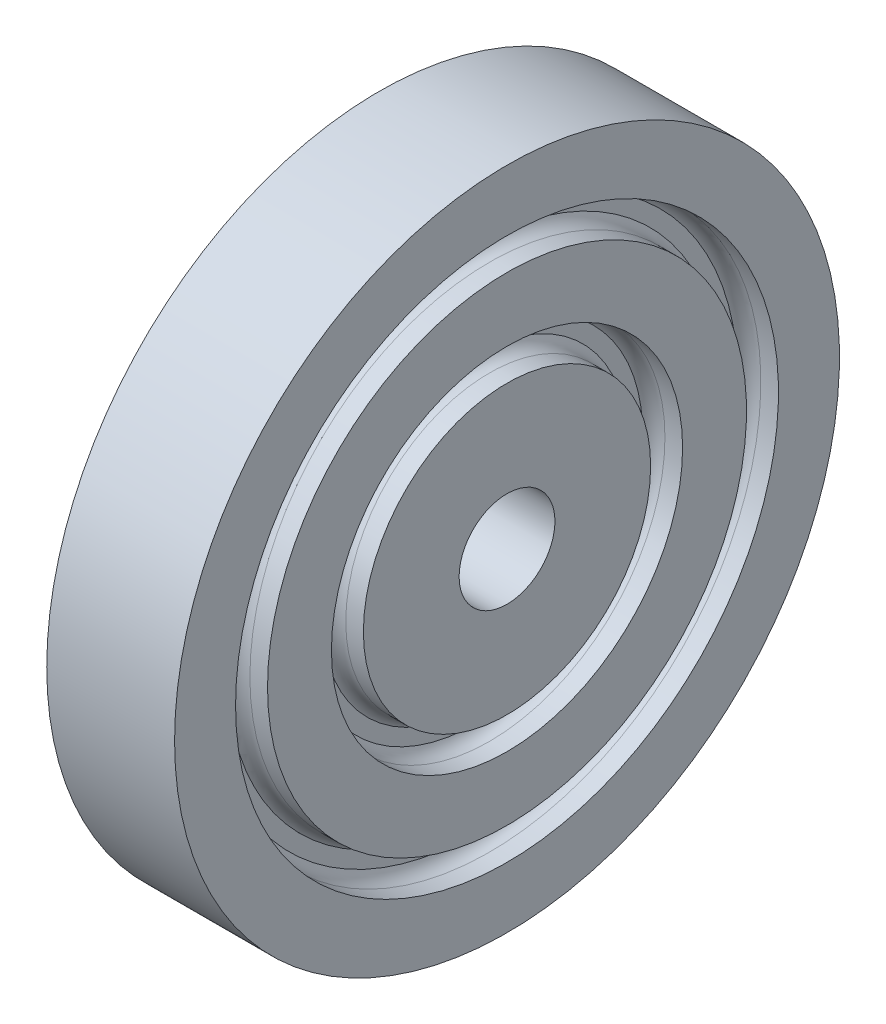
ISO-10303-21;
HEADER;
FILE_DESCRIPTION(('STEP AP214'),'2;1');
FILE_NAME('part.step','',(''),(''),'','','');
FILE_SCHEMA(('AUTOMOTIVE_DESIGN { 1 0 10303 214 1 1 1 1 }'));
ENDSEC;
DATA;
#1=APPLICATION_CONTEXT('core data for automotive mechanical design processes');
#2=APPLICATION_PROTOCOL_DEFINITION('international standard','automotive_design',2000,#1);
#3=PRODUCT_CONTEXT('',#1,'mechanical');
#4=PRODUCT('Part','Part','',(#3));
#5=PRODUCT_RELATED_PRODUCT_CATEGORY('part','',(#4));
#6=PRODUCT_DEFINITION_FORMATION('','',#4);
#7=PRODUCT_DEFINITION_CONTEXT('part definition',#1,'design');
#8=PRODUCT_DEFINITION('design','',#6,#7);
#9=PRODUCT_DEFINITION_SHAPE('','',#8);
#10=(LENGTH_UNIT() NAMED_UNIT(*) SI_UNIT(.MILLI.,.METRE.));
#11=(NAMED_UNIT(*) PLANE_ANGLE_UNIT() SI_UNIT($,.RADIAN.));
#12=(NAMED_UNIT(*) SI_UNIT($,.STERADIAN.) SOLID_ANGLE_UNIT());
#13=UNCERTAINTY_MEASURE_WITH_UNIT(LENGTH_MEASURE(1.E-05),#10,'distance_accuracy_value','');
#14=(GEOMETRIC_REPRESENTATION_CONTEXT(3) GLOBAL_UNCERTAINTY_ASSIGNED_CONTEXT((#13)) GLOBAL_UNIT_ASSIGNED_CONTEXT((#10,
#11,#12)) REPRESENTATION_CONTEXT('',''));
#15=CARTESIAN_POINT('',(0.,0.,0.));
#16=DIRECTION('',(0.,0.,1.));
#17=DIRECTION('',(1.,0.,0.));
#18=AXIS2_PLACEMENT_3D('',#15,#16,#17);
#19=CARTESIAN_POINT('',(-1.07134394896736,-1.61557345247424,0.));
#20=DIRECTION('',(-1.,0.,0.));
#21=DIRECTION('',(0.,0.,1.));
#22=AXIS2_PLACEMENT_3D('',#19,#20,#21);
#23=CYLINDRICAL_SURFACE('',#22,1.34761288189039);
#24=CARTESIAN_POINT('',(0.,-1.61557345247424,0.));
#25=DIRECTION('',(-1.,0.,0.));
#26=DIRECTION('',(0.,0.,1.));
#27=AXIS2_PLACEMENT_3D('',#24,#25,#26);
#28=CIRCLE('',#27,1.34761288189039);
#29=CARTESIAN_POINT('',(0.,-1.61557345247424,1.34761288189039));
#30=VERTEX_POINT('',#29);
#31=EDGE_CURVE('E121',#30,#30,#28,.T.);
#32=ORIENTED_EDGE('',*,*,#31,.T.);
#33=EDGE_LOOP('',(#32));
#34=FACE_BOUND('',#33,.T.);
#35=CARTESIAN_POINT('',(0.146155721721138,-1.61557345247424,0.));
#36=DIRECTION('',(-1.,0.,0.));
#37=DIRECTION('',(0.,0.,1.));
#38=AXIS2_PLACEMENT_3D('',#35,#36,#37);
#39=CIRCLE('',#38,1.34761288189039);
#40=CARTESIAN_POINT('',(0.146155721721138,-1.61557345247424,1.34761288189039));
#41=VERTEX_POINT('',#40);
#42=EDGE_CURVE('E10',#41,#41,#39,.T.);
#43=ORIENTED_EDGE('',*,*,#42,.F.);
#44=EDGE_LOOP('',(#43));
#45=FACE_BOUND('',#44,.T.);
#46=ADVANCED_FACE('F33',(#34,#45),#23,.F.);
#47=CARTESIAN_POINT('',(0.137801848656548,-1.61557345247424,0.));
#48=DIRECTION('',(-1.,0.,0.));
#49=DIRECTION('',(0.,0.,1.));
#50=AXIS2_PLACEMENT_3D('',#47,#48,#49);
#51=TOROIDAL_SURFACE('',#50,1.21608798375135,0.131789931427495);
#52=CARTESIAN_POINT('',(0.252119261734422,-1.61557345247424,0.));
#53=DIRECTION('',(-1.,0.,0.));
#54=DIRECTION('',(0.,0.,1.));
#55=AXIS2_PLACEMENT_3D('',#52,#53,#54);
#56=CIRCLE('',#55,1.28166324656323);
#57=CARTESIAN_POINT('',(0.252119261734422,-1.61557345247424,1.28166324656323));
#58=VERTEX_POINT('',#57);
#59=EDGE_CURVE('E39',#58,#58,#56,.T.);
#60=ORIENTED_EDGE('',*,*,#59,.F.);
#61=EDGE_LOOP('',(#60));
#62=FACE_BOUND('',#61,.T.);
#63=ORIENTED_EDGE('',*,*,#42,.T.);
#64=EDGE_LOOP('',(#63));
#65=FACE_BOUND('',#64,.T.);
#66=ADVANCED_FACE('F151',(#62,#65),#51,.F.);
#67=CARTESIAN_POINT('',(0.252119261734422,0.,0.));
#68=DIRECTION('',(-1.,0.,0.));
#69=DIRECTION('',(0.,0.,1.));
#70=AXIS2_PLACEMENT_3D('',#67,#68,#69);
#71=PLANE('',#70);
#72=ORIENTED_EDGE('',*,*,#59,.T.);
#73=EDGE_LOOP('',(#72));
#74=FACE_BOUND('',#73,.T.);
#75=CARTESIAN_POINT('',(0.252119261734422,-1.61557345247424,0.));
#76=DIRECTION('',(-1.,0.,0.));
#77=DIRECTION('',(0.,0.,1.));
#78=AXIS2_PLACEMENT_3D('',#75,#76,#77);
#79=CIRCLE('',#78,1.17169865184732);
#80=CARTESIAN_POINT('',(0.252119261734422,-1.61557345247424,1.17169865184732));
#81=VERTEX_POINT('',#80);
#82=EDGE_CURVE('E43',#81,#81,#79,.T.);
#83=ORIENTED_EDGE('',*,*,#82,.F.);
#84=EDGE_LOOP('',(#83));
#85=FACE_BOUND('',#84,.T.);
#86=ADVANCED_FACE('F155',(#74,#85),#71,.T.);
#87=CARTESIAN_POINT('',(0.137890983876598,-1.61557345247424,0.));
#88=DIRECTION('',(-1.,0.,0.));
#89=DIRECTION('',(0.,0.,1.));
#90=AXIS2_PLACEMENT_3D('',#87,#88,#89);
#91=TOROIDAL_SURFACE('',#90,1.22246183277243,0.125);
#92=ORIENTED_EDGE('',*,*,#82,.T.);
#93=EDGE_LOOP('',(#92));
#94=FACE_BOUND('',#93,.T.);
#95=CARTESIAN_POINT('',(0.146155721721138,-1.61557345247424,0.));
#96=DIRECTION('',(-1.,0.,0.));
#97=DIRECTION('',(0.,0.,1.));
#98=AXIS2_PLACEMENT_3D('',#95,#96,#97);
#99=CIRCLE('',#98,1.09773535559793);
#100=CARTESIAN_POINT('',(0.146155721721138,-1.61557345247424,1.09773535559793));
#101=VERTEX_POINT('',#100);
#102=EDGE_CURVE('E47',#101,#101,#99,.T.);
#103=ORIENTED_EDGE('',*,*,#102,.F.);
#104=EDGE_LOOP('',(#103));
#105=FACE_BOUND('',#104,.T.);
#106=ADVANCED_FACE('F160',(#94,#105),#91,.F.);
#107=CARTESIAN_POINT('',(0.,-1.61557345247424,0.));
#108=DIRECTION('',(1.,0.,0.));
#109=DIRECTION('',(0.,0.,-1.));
#110=AXIS2_PLACEMENT_3D('',#107,#108,#109);
#111=CONICAL_SURFACE('',#110,1.09761288189039,0.000837967049351085);
#112=ORIENTED_EDGE('',*,*,#102,.T.);
#113=EDGE_LOOP('',(#112));
#114=FACE_BOUND('',#113,.T.);
#115=CARTESIAN_POINT('',(0.,-1.61557345247424,0.));
#116=DIRECTION('',(-1.,0.,0.));
#117=DIRECTION('',(0.,0.,1.));
#118=AXIS2_PLACEMENT_3D('',#115,#116,#117);
#119=CIRCLE('',#118,1.09761288189039);
#120=CARTESIAN_POINT('',(0.,-1.61557345247424,1.09761288189039));
#121=VERTEX_POINT('',#120);
#122=EDGE_CURVE('E52',#121,#121,#119,.T.);
#123=ORIENTED_EDGE('',*,*,#122,.F.);
#124=EDGE_LOOP('',(#123));
#125=FACE_BOUND('',#124,.T.);
#126=ADVANCED_FACE('F165',(#114,#125),#111,.T.);
#127=CARTESIAN_POINT('',(0.,0.,0.));
#128=DIRECTION('',(1.,0.,0.));
#129=DIRECTION('',(0.,0.,-1.));
#130=AXIS2_PLACEMENT_3D('',#127,#128,#129);
#131=PLANE('',#130);
#132=CARTESIAN_POINT('',(0.,-1.61557345247424,0.));
#133=DIRECTION('',(-1.,0.,0.));
#134=DIRECTION('',(0.,0.,1.));
#135=AXIS2_PLACEMENT_3D('',#132,#133,#134);
#136=CIRCLE('',#135,0.374707986907648);
#137=CARTESIAN_POINT('',(0.,-1.61557345247424,0.374707986907648));
#138=VERTEX_POINT('',#137);
#139=EDGE_CURVE('E55',#138,#138,#136,.T.);
#140=ORIENTED_EDGE('',*,*,#139,.F.);
#141=EDGE_LOOP('',(#140));
#142=FACE_BOUND('',#141,.T.);
#143=ORIENTED_EDGE('',*,*,#122,.T.);
#144=EDGE_LOOP('',(#143));
#145=FACE_BOUND('',#144,.T.);
#146=ADVANCED_FACE('F169',(#142,#145),#131,.F.);
#147=CARTESIAN_POINT('',(-1.07134394896736,-1.61557345247424,0.));
#148=DIRECTION('',(-1.,0.,0.));
#149=DIRECTION('',(0.,0.,1.));
#150=AXIS2_PLACEMENT_3D('',#147,#148,#149);
#151=CYLINDRICAL_SURFACE('',#150,0.374707986907648);
#152=ORIENTED_EDGE('',*,*,#139,.T.);
#153=EDGE_LOOP('',(#152));
#154=FACE_BOUND('',#153,.T.);
#155=CARTESIAN_POINT('',(1.,-1.61557345247424,0.));
#156=DIRECTION('',(-1.,0.,0.));
#157=DIRECTION('',(0.,0.,1.));
#158=AXIS2_PLACEMENT_3D('',#155,#156,#157);
#159=CIRCLE('',#158,0.374707986907648);
#160=CARTESIAN_POINT('',(1.,-1.61557345247424,0.374707986907648));
#161=VERTEX_POINT('',#160);
#162=EDGE_CURVE('E58',#161,#161,#159,.T.);
#163=ORIENTED_EDGE('',*,*,#162,.F.);
#164=EDGE_LOOP('',(#163));
#165=FACE_BOUND('',#164,.T.);
#166=ADVANCED_FACE('F173',(#154,#165),#151,.F.);
#167=CARTESIAN_POINT('',(1.,0.,0.));
#168=DIRECTION('',(1.,0.,0.));
#169=DIRECTION('',(0.,0.,-1.));
#170=AXIS2_PLACEMENT_3D('',#167,#168,#169);
#171=PLANE('',#170);
#172=ORIENTED_EDGE('',*,*,#162,.T.);
#173=EDGE_LOOP('',(#172));
#174=FACE_BOUND('',#173,.T.);
#175=CARTESIAN_POINT('',(1.,-1.61557345247424,0.));
#176=DIRECTION('',(-1.,0.,0.));
#177=DIRECTION('',(0.,0.,1.));
#178=AXIS2_PLACEMENT_3D('',#175,#176,#177);
#179=CIRCLE('',#178,1.12347935603458);
#180=CARTESIAN_POINT('',(1.,-1.61557345247424,1.12347935603458));
#181=VERTEX_POINT('',#180);
#182=EDGE_CURVE('E61',#181,#181,#179,.T.);
#183=ORIENTED_EDGE('',*,*,#182,.F.);
#184=EDGE_LOOP('',(#183));
#185=FACE_BOUND('',#184,.T.);
#186=ADVANCED_FACE('F177',(#174,#185),#171,.T.);
#187=CARTESIAN_POINT('',(-1.07134394896736,-1.61557345247424,0.));
#188=DIRECTION('',(-1.,0.,0.));
#189=DIRECTION('',(0.,0.,1.));
#190=AXIS2_PLACEMENT_3D('',#187,#188,#189);
#191=CYLINDRICAL_SURFACE('',#190,1.12347935603458);
#192=CARTESIAN_POINT('',(0.862034400093369,-1.61557345247424,0.));
#193=DIRECTION('',(-1.,0.,0.));
#194=DIRECTION('',(0.,0.,1.));
#195=AXIS2_PLACEMENT_3D('',#192,#193,#194);
#196=CIRCLE('',#195,1.12347935603458);
#197=CARTESIAN_POINT('',(0.862034400093369,-1.61557345247424,1.12347935603458));
#198=VERTEX_POINT('',#197);
#199=EDGE_CURVE('E64',#198,#198,#196,.T.);
#200=ORIENTED_EDGE('',*,*,#199,.F.);
#201=EDGE_LOOP('',(#200));
#202=FACE_BOUND('',#201,.T.);
#203=ORIENTED_EDGE('',*,*,#182,.T.);
#204=EDGE_LOOP('',(#203));
#205=FACE_BOUND('',#204,.T.);
#206=ADVANCED_FACE('F179',(#202,#205),#191,.T.);
#207=CARTESIAN_POINT('',(0.862034400093369,-1.61557345247424,0.));
#208=DIRECTION('',(-1.,0.,0.));
#209=DIRECTION('',(0.,0.,1.));
#210=AXIS2_PLACEMENT_3D('',#207,#208,#209);
#211=TOROIDAL_SURFACE('',#210,1.24847935603458,0.125);
#212=CARTESIAN_POINT('',(0.75,-1.61557345247424,0.));
#213=DIRECTION('',(-1.,0.,0.));
#214=DIRECTION('',(0.,0.,1.));
#215=AXIS2_PLACEMENT_3D('',#212,#213,#214);
#216=CIRCLE('',#215,1.1930420653746);
#217=CARTESIAN_POINT('',(0.75,-1.61557345247424,1.1930420653746));
#218=VERTEX_POINT('',#217);
#219=EDGE_CURVE('E67',#218,#218,#216,.T.);
#220=ORIENTED_EDGE('',*,*,#219,.F.);
#221=EDGE_LOOP('',(#220));
#222=FACE_BOUND('',#221,.T.);
#223=ORIENTED_EDGE('',*,*,#199,.T.);
#224=EDGE_LOOP('',(#223));
#225=FACE_BOUND('',#224,.T.);
#226=ADVANCED_FACE('F182',(#222,#225),#211,.F.);
#227=CARTESIAN_POINT('',(0.75,0.,0.));
#228=DIRECTION('',(-1.,0.,0.));
#229=DIRECTION('',(0.,0.,1.));
#230=AXIS2_PLACEMENT_3D('',#227,#228,#229);
#231=PLANE('',#230);
#232=CARTESIAN_POINT('',(0.75,-1.61557345247424,0.));
#233=DIRECTION('',(-1.,0.,0.));
#234=DIRECTION('',(0.,0.,1.));
#235=AXIS2_PLACEMENT_3D('',#232,#233,#234);
#236=CIRCLE('',#235,1.31109316529433);
#237=CARTESIAN_POINT('',(0.75,-1.61557345247424,1.31109316529433));
#238=VERTEX_POINT('',#237);
#239=EDGE_CURVE('E70',#238,#238,#236,.T.);
#240=ORIENTED_EDGE('',*,*,#239,.F.);
#241=EDGE_LOOP('',(#240));
#242=FACE_BOUND('',#241,.T.);
#243=ORIENTED_EDGE('',*,*,#219,.T.);
#244=EDGE_LOOP('',(#243));
#245=FACE_BOUND('',#244,.T.);
#246=ADVANCED_FACE('F186',(#242,#245),#231,.F.);
#247=CARTESIAN_POINT('',(0.862034400093369,-1.61557345247424,0.));
#248=DIRECTION('',(-1.,0.,0.));
#249=DIRECTION('',(0.,0.,1.));
#250=AXIS2_PLACEMENT_3D('',#247,#248,#249);
#251=TOROIDAL_SURFACE('',#250,1.24168942460708,0.131789931427495);
#252=ORIENTED_EDGE('',*,*,#239,.T.);
#253=EDGE_LOOP('',(#252));
#254=FACE_BOUND('',#253,.T.);
#255=CARTESIAN_POINT('',(0.86203440009337,-1.61557345247424,0.));
#256=DIRECTION('',(-1.,0.,0.));
#257=DIRECTION('',(0.,0.,1.));
#258=AXIS2_PLACEMENT_3D('',#255,#256,#257);
#259=CIRCLE('',#258,1.37347935603458);
#260=CARTESIAN_POINT('',(0.86203440009337,-1.61557345247424,1.37347935603458));
#261=VERTEX_POINT('',#260);
#262=EDGE_CURVE('E73',#261,#261,#259,.T.);
#263=ORIENTED_EDGE('',*,*,#262,.F.);
#264=EDGE_LOOP('',(#263));
#265=FACE_BOUND('',#264,.T.);
#266=ADVANCED_FACE('F190',(#254,#265),#251,.F.);
#267=CARTESIAN_POINT('',(-1.07134394896736,-1.61557345247424,0.));
#268=DIRECTION('',(-1.,0.,0.));
#269=DIRECTION('',(0.,0.,1.));
#270=AXIS2_PLACEMENT_3D('',#267,#268,#269);
#271=CYLINDRICAL_SURFACE('',#270,1.37347935603458);
#272=CARTESIAN_POINT('',(1.,-1.61557345247424,0.));
#273=DIRECTION('',(-1.,0.,0.));
#274=DIRECTION('',(0.,0.,1.));
#275=AXIS2_PLACEMENT_3D('',#272,#273,#274);
#276=CIRCLE('',#275,1.37347935603458);
#277=CARTESIAN_POINT('',(1.,-1.61557345247424,1.37347935603458));
#278=VERTEX_POINT('',#277);
#279=EDGE_CURVE('E76',#278,#278,#276,.T.);
#280=ORIENTED_EDGE('',*,*,#279,.F.);
#281=EDGE_LOOP('',(#280));
#282=FACE_BOUND('',#281,.T.);
#283=ORIENTED_EDGE('',*,*,#262,.T.);
#284=EDGE_LOOP('',(#283));
#285=FACE_BOUND('',#284,.T.);
#286=ADVANCED_FACE('F194',(#282,#285),#271,.F.);
#287=ORIENTED_EDGE('',*,*,#279,.T.);
#288=EDGE_LOOP('',(#287));
#289=FACE_BOUND('',#288,.T.);
#290=CARTESIAN_POINT('',(1.,-1.61557345247424,0.));
#291=DIRECTION('',(-1.,0.,0.));
#292=DIRECTION('',(0.,0.,1.));
#293=AXIS2_PLACEMENT_3D('',#290,#291,#292);
#294=CIRCLE('',#293,1.87347935603458);
#295=CARTESIAN_POINT('',(1.,-1.61557345247424,1.87347935603458));
#296=VERTEX_POINT('',#295);
#297=EDGE_CURVE('E79',#296,#296,#294,.T.);
#298=ORIENTED_EDGE('',*,*,#297,.F.);
#299=EDGE_LOOP('',(#298));
#300=FACE_BOUND('',#299,.T.);
#301=ADVANCED_FACE('F198',(#289,#300),#171,.T.);
#302=CARTESIAN_POINT('',(-1.07134394896736,-1.61557345247424,0.));
#303=DIRECTION('',(-1.,0.,0.));
#304=DIRECTION('',(0.,0.,1.));
#305=AXIS2_PLACEMENT_3D('',#302,#303,#304);
#306=CYLINDRICAL_SURFACE('',#305,1.87347935603458);
#307=ORIENTED_EDGE('',*,*,#297,.T.);
#308=EDGE_LOOP('',(#307));
#309=FACE_BOUND('',#308,.T.);
#310=CARTESIAN_POINT('',(0.86203440009337,-1.61557345247424,0.));
#311=DIRECTION('',(-1.,0.,0.));
#312=DIRECTION('',(0.,0.,1.));
#313=AXIS2_PLACEMENT_3D('',#310,#311,#312);
#314=CIRCLE('',#313,1.87347935603458);
#315=CARTESIAN_POINT('',(0.86203440009337,-1.61557345247424,1.87347935603458));
#316=VERTEX_POINT('',#315);
#317=EDGE_CURVE('E82',#316,#316,#314,.T.);
#318=ORIENTED_EDGE('',*,*,#317,.F.);
#319=EDGE_LOOP('',(#318));
#320=FACE_BOUND('',#319,.T.);
#321=ADVANCED_FACE('F202',(#309,#320),#306,.T.);
#322=CARTESIAN_POINT('',(0.862034400093369,-1.61557345247424,0.));
#323=DIRECTION('',(-1.,0.,0.));
#324=DIRECTION('',(0.,0.,1.));
#325=AXIS2_PLACEMENT_3D('',#322,#323,#324);
#326=TOROIDAL_SURFACE('',#325,2.00526928746208,0.131789931427495);
#327=CARTESIAN_POINT('',(0.75,-1.61557345247424,0.));
#328=DIRECTION('',(-1.,0.,0.));
#329=DIRECTION('',(0.,0.,1.));
#330=AXIS2_PLACEMENT_3D('',#327,#328,#329);
#331=CIRCLE('',#330,1.93586554677483);
#332=CARTESIAN_POINT('',(0.75,-1.61557345247424,1.93586554677483));
#333=VERTEX_POINT('',#332);
#334=EDGE_CURVE('E85',#333,#333,#331,.T.);
#335=ORIENTED_EDGE('',*,*,#334,.F.);
#336=EDGE_LOOP('',(#335));
#337=FACE_BOUND('',#336,.T.);
#338=ORIENTED_EDGE('',*,*,#317,.T.);
#339=EDGE_LOOP('',(#338));
#340=FACE_BOUND('',#339,.T.);
#341=ADVANCED_FACE('F206',(#337,#340),#326,.F.);
#342=CARTESIAN_POINT('',(0.75,0.,0.));
#343=DIRECTION('',(1.,0.,0.));
#344=DIRECTION('',(0.,0.,-1.));
#345=AXIS2_PLACEMENT_3D('',#342,#343,#344);
#346=PLANE('',#345);
#347=ORIENTED_EDGE('',*,*,#334,.T.);
#348=EDGE_LOOP('',(#347));
#349=FACE_BOUND('',#348,.T.);
#350=CARTESIAN_POINT('',(0.75,-1.61557345247424,0.));
#351=DIRECTION('',(-1.,0.,0.));
#352=DIRECTION('',(0.,0.,1.));
#353=AXIS2_PLACEMENT_3D('',#350,#351,#352);
#354=CIRCLE('',#353,2.05391664669456);
#355=CARTESIAN_POINT('',(0.75,-1.61557345247424,2.05391664669456));
#356=VERTEX_POINT('',#355);
#357=EDGE_CURVE('E88',#356,#356,#354,.T.);
#358=ORIENTED_EDGE('',*,*,#357,.F.);
#359=EDGE_LOOP('',(#358));
#360=FACE_BOUND('',#359,.T.);
#361=ADVANCED_FACE('F210',(#349,#360),#346,.T.);
#362=CARTESIAN_POINT('',(0.862034400093369,-1.61557345247424,0.));
#363=DIRECTION('',(-1.,0.,0.));
#364=DIRECTION('',(0.,0.,1.));
#365=AXIS2_PLACEMENT_3D('',#362,#363,#364);
#366=TOROIDAL_SURFACE('',#365,1.99847935603458,0.125);
#367=ORIENTED_EDGE('',*,*,#357,.T.);
#368=EDGE_LOOP('',(#367));
#369=FACE_BOUND('',#368,.T.);
#370=CARTESIAN_POINT('',(0.862034400093369,-1.61557345247424,0.));
#371=DIRECTION('',(-1.,0.,0.));
#372=DIRECTION('',(0.,0.,1.));
#373=AXIS2_PLACEMENT_3D('',#370,#371,#372);
#374=CIRCLE('',#373,2.12347935603458);
#375=CARTESIAN_POINT('',(0.862034400093369,-1.61557345247424,2.12347935603458));
#376=VERTEX_POINT('',#375);
#377=EDGE_CURVE('E91',#376,#376,#374,.T.);
#378=ORIENTED_EDGE('',*,*,#377,.F.);
#379=EDGE_LOOP('',(#378));
#380=FACE_BOUND('',#379,.T.);
#381=ADVANCED_FACE('F214',(#369,#380),#366,.F.);
#382=CARTESIAN_POINT('',(-1.07134394896736,-1.61557345247424,0.));
#383=DIRECTION('',(-1.,0.,0.));
#384=DIRECTION('',(0.,0.,1.));
#385=AXIS2_PLACEMENT_3D('',#382,#383,#384);
#386=CYLINDRICAL_SURFACE('',#385,2.12347935603458);
#387=ORIENTED_EDGE('',*,*,#377,.T.);
#388=EDGE_LOOP('',(#387));
#389=FACE_BOUND('',#388,.T.);
#390=CARTESIAN_POINT('',(1.,-1.61557345247424,0.));
#391=DIRECTION('',(-1.,0.,0.));
#392=DIRECTION('',(0.,0.,1.));
#393=AXIS2_PLACEMENT_3D('',#390,#391,#392);
#394=CIRCLE('',#393,2.12347935603458);
#395=CARTESIAN_POINT('',(1.,-1.61557345247424,2.12347935603458));
#396=VERTEX_POINT('',#395);
#397=EDGE_CURVE('E94',#396,#396,#394,.T.);
#398=ORIENTED_EDGE('',*,*,#397,.F.);
#399=EDGE_LOOP('',(#398));
#400=FACE_BOUND('',#399,.T.);
#401=ADVANCED_FACE('F218',(#389,#400),#386,.F.);
#402=CARTESIAN_POINT('',(1.,0.,0.));
#403=DIRECTION('',(1.,0.,0.));
#404=DIRECTION('',(0.,0.,-1.));
#405=AXIS2_PLACEMENT_3D('',#402,#403,#404);
#406=PLANE('',#405);
#407=ORIENTED_EDGE('',*,*,#397,.T.);
#408=EDGE_LOOP('',(#407));
#409=FACE_BOUND('',#408,.T.);
#410=CARTESIAN_POINT('',(1.,-1.61557345247424,0.));
#411=DIRECTION('',(-1.,0.,0.));
#412=DIRECTION('',(0.,0.,1.));
#413=AXIS2_PLACEMENT_3D('',#410,#411,#412);
#414=CIRCLE('',#413,2.60051777687314);
#415=CARTESIAN_POINT('',(1.,-1.61557345247424,2.60051777687314));
#416=VERTEX_POINT('',#415);
#417=EDGE_CURVE('E97',#416,#416,#414,.T.);
#418=ORIENTED_EDGE('',*,*,#417,.F.);
#419=EDGE_LOOP('',(#418));
#420=FACE_BOUND('',#419,.T.);
#421=ADVANCED_FACE('F222',(#409,#420),#406,.T.);
#422=CARTESIAN_POINT('',(-1.07134394896736,-1.61557345247424,0.));
#423=DIRECTION('',(-1.,0.,0.));
#424=DIRECTION('',(0.,0.,1.));
#425=AXIS2_PLACEMENT_3D('',#422,#423,#424);
#426=CYLINDRICAL_SURFACE('',#425,2.60051777687314);
#427=ORIENTED_EDGE('',*,*,#417,.T.);
#428=EDGE_LOOP('',(#427));
#429=FACE_BOUND('',#428,.T.);
#430=CARTESIAN_POINT('',(0.,-1.61557345247424,0.));
#431=DIRECTION('',(-1.,0.,0.));
#432=DIRECTION('',(0.,0.,1.));
#433=AXIS2_PLACEMENT_3D('',#430,#431,#432);
#434=CIRCLE('',#433,2.60051777687314);
#435=CARTESIAN_POINT('',(0.,-1.61557345247424,2.60051777687314));
#436=VERTEX_POINT('',#435);
#437=EDGE_CURVE('E100',#436,#436,#434,.T.);
#438=ORIENTED_EDGE('',*,*,#437,.F.);
#439=EDGE_LOOP('',(#438));
#440=FACE_BOUND('',#439,.T.);
#441=ADVANCED_FACE('F226',(#429,#440),#426,.T.);
#442=CARTESIAN_POINT('',(0.,0.,0.));
#443=DIRECTION('',(1.,0.,0.));
#444=DIRECTION('',(0.,0.,-1.));
#445=AXIS2_PLACEMENT_3D('',#442,#443,#444);
#446=PLANE('',#445);
#447=CARTESIAN_POINT('',(0.,-1.61557345247424,0.));
#448=DIRECTION('',(-1.,0.,0.));
#449=DIRECTION('',(0.,0.,1.));
#450=AXIS2_PLACEMENT_3D('',#447,#448,#449);
#451=CIRCLE('',#450,2.12347935603458);
#452=CARTESIAN_POINT('',(0.,-1.61557345247424,2.12347935603458));
#453=VERTEX_POINT('',#452);
#454=EDGE_CURVE('E103',#453,#453,#451,.T.);
#455=ORIENTED_EDGE('',*,*,#454,.F.);
#456=EDGE_LOOP('',(#455));
#457=FACE_BOUND('',#456,.T.);
#458=ORIENTED_EDGE('',*,*,#437,.T.);
#459=EDGE_LOOP('',(#458));
#460=FACE_BOUND('',#459,.T.);
#461=ADVANCED_FACE('F230',(#457,#460),#446,.F.);
#462=CARTESIAN_POINT('',(-1.07134394896736,-1.61557345247424,0.));
#463=DIRECTION('',(-1.,0.,0.));
#464=DIRECTION('',(0.,0.,1.));
#465=AXIS2_PLACEMENT_3D('',#462,#463,#464);
#466=CYLINDRICAL_SURFACE('',#465,2.12347935603458);
#467=CARTESIAN_POINT('',(0.137965599906632,-1.61557345247424,0.));
#468=DIRECTION('',(-1.,0.,0.));
#469=DIRECTION('',(0.,0.,1.));
#470=AXIS2_PLACEMENT_3D('',#467,#468,#469);
#471=CIRCLE('',#470,2.12347935603458);
#472=CARTESIAN_POINT('',(0.137965599906632,-1.61557345247424,2.12347935603458));
#473=VERTEX_POINT('',#472);
#474=EDGE_CURVE('E106',#473,#473,#471,.T.);
#475=ORIENTED_EDGE('',*,*,#474,.F.);
#476=EDGE_LOOP('',(#475));
#477=FACE_BOUND('',#476,.T.);
#478=ORIENTED_EDGE('',*,*,#454,.T.);
#479=EDGE_LOOP('',(#478));
#480=FACE_BOUND('',#479,.T.);
#481=ADVANCED_FACE('F234',(#477,#480),#466,.F.);
#482=CARTESIAN_POINT('',(0.137965599906632,-1.61557345247424,0.));
#483=DIRECTION('',(-1.,0.,0.));
#484=DIRECTION('',(0.,0.,1.));
#485=AXIS2_PLACEMENT_3D('',#482,#483,#484);
#486=TOROIDAL_SURFACE('',#485,1.99847935603458,0.125);
#487=CARTESIAN_POINT('',(0.25,-1.61557345247424,0.));
#488=DIRECTION('',(-1.,0.,0.));
#489=DIRECTION('',(0.,0.,1.));
#490=AXIS2_PLACEMENT_3D('',#487,#488,#489);
#491=CIRCLE('',#490,2.05391664669456);
#492=CARTESIAN_POINT('',(0.25,-1.61557345247424,2.05391664669456));
#493=VERTEX_POINT('',#492);
#494=EDGE_CURVE('E109',#493,#493,#491,.T.);
#495=ORIENTED_EDGE('',*,*,#494,.F.);
#496=EDGE_LOOP('',(#495));
#497=FACE_BOUND('',#496,.T.);
#498=ORIENTED_EDGE('',*,*,#474,.T.);
#499=EDGE_LOOP('',(#498));
#500=FACE_BOUND('',#499,.T.);
#501=ADVANCED_FACE('F147',(#497,#500),#486,.F.);
#502=CARTESIAN_POINT('',(0.25,0.,0.));
#503=DIRECTION('',(1.,0.,0.));
#504=DIRECTION('',(0.,0.,-1.));
#505=AXIS2_PLACEMENT_3D('',#502,#503,#504);
#506=PLANE('',#505);
#507=CARTESIAN_POINT('',(0.25,-1.61557345247424,0.));
#508=DIRECTION('',(-1.,0.,0.));
#509=DIRECTION('',(0.,0.,1.));
#510=AXIS2_PLACEMENT_3D('',#507,#508,#509);
#511=CIRCLE('',#510,1.93586554677483);
#512=CARTESIAN_POINT('',(0.25,-1.61557345247424,1.93586554677483));
#513=VERTEX_POINT('',#512);
#514=EDGE_CURVE('E112',#513,#513,#511,.T.);
#515=ORIENTED_EDGE('',*,*,#514,.F.);
#516=EDGE_LOOP('',(#515));
#517=FACE_BOUND('',#516,.T.);
#518=ORIENTED_EDGE('',*,*,#494,.T.);
#519=EDGE_LOOP('',(#518));
#520=FACE_BOUND('',#519,.T.);
#521=ADVANCED_FACE('F141',(#517,#520),#506,.F.);
#522=CARTESIAN_POINT('',(0.137965599906631,-1.61557345247424,0.));
#523=DIRECTION('',(-1.,0.,0.));
#524=DIRECTION('',(0.,0.,1.));
#525=AXIS2_PLACEMENT_3D('',#522,#523,#524);
#526=TOROIDAL_SURFACE('',#525,2.00526928746207,0.131789931427495);
#527=ORIENTED_EDGE('',*,*,#514,.T.);
#528=EDGE_LOOP('',(#527));
#529=FACE_BOUND('',#528,.T.);
#530=CARTESIAN_POINT('',(0.137965599906631,-1.61557345247424,0.));
#531=DIRECTION('',(-1.,0.,0.));
#532=DIRECTION('',(0.,0.,1.));
#533=AXIS2_PLACEMENT_3D('',#530,#531,#532);
#534=CIRCLE('',#533,1.87347935603458);
#535=CARTESIAN_POINT('',(0.137965599906631,-1.61557345247424,1.87347935603458));
#536=VERTEX_POINT('',#535);
#537=EDGE_CURVE('E115',#536,#536,#534,.T.);
#538=ORIENTED_EDGE('',*,*,#537,.F.);
#539=EDGE_LOOP('',(#538));
#540=FACE_BOUND('',#539,.T.);
#541=ADVANCED_FACE('F136',(#529,#540),#526,.F.);
#542=CARTESIAN_POINT('',(-1.07134394896736,-1.61557345247424,0.));
#543=DIRECTION('',(-1.,0.,0.));
#544=DIRECTION('',(0.,0.,1.));
#545=AXIS2_PLACEMENT_3D('',#542,#543,#544);
#546=CYLINDRICAL_SURFACE('',#545,1.87347935603458);
#547=CARTESIAN_POINT('',(0.,-1.61557345247424,0.));
#548=DIRECTION('',(-1.,0.,0.));
#549=DIRECTION('',(0.,0.,1.));
#550=AXIS2_PLACEMENT_3D('',#547,#548,#549);
#551=CIRCLE('',#550,1.87347935603458);
#552=CARTESIAN_POINT('',(0.,-1.61557345247424,1.87347935603458));
#553=VERTEX_POINT('',#552);
#554=EDGE_CURVE('E118',#553,#553,#551,.T.);
#555=ORIENTED_EDGE('',*,*,#554,.F.);
#556=EDGE_LOOP('',(#555));
#557=FACE_BOUND('',#556,.T.);
#558=ORIENTED_EDGE('',*,*,#537,.T.);
#559=EDGE_LOOP('',(#558));
#560=FACE_BOUND('',#559,.T.);
#561=ADVANCED_FACE('F130',(#557,#560),#546,.T.);
#562=CARTESIAN_POINT('',(0.,0.,0.));
#563=DIRECTION('',(1.,0.,0.));
#564=DIRECTION('',(0.,0.,-1.));
#565=AXIS2_PLACEMENT_3D('',#562,#563,#564);
#566=PLANE('',#565);
#567=ORIENTED_EDGE('',*,*,#31,.F.);
#568=EDGE_LOOP('',(#567));
#569=FACE_BOUND('',#568,.T.);
#570=ORIENTED_EDGE('',*,*,#554,.T.);
#571=EDGE_LOOP('',(#570));
#572=FACE_BOUND('',#571,.T.);
#573=ADVANCED_FACE('F127',(#569,#572),#566,.F.);
#574=CLOSED_SHELL('',(#46,#66,#86,#106,#126,#146,#166,#186,#206,#226,#246,#266,#286,#301,#321,
#341,#361,#381,#401,#421,#441,#461,#481,#501,#521,#541,#561,#573));
#575=MANIFOLD_SOLID_BREP('B2',#574);
#576=ADVANCED_BREP_SHAPE_REPRESENTATION('',(#18,#575),#14);
#577=SHAPE_DEFINITION_REPRESENTATION(#9,#576);
ENDSEC;
END-ISO-10303-21;
